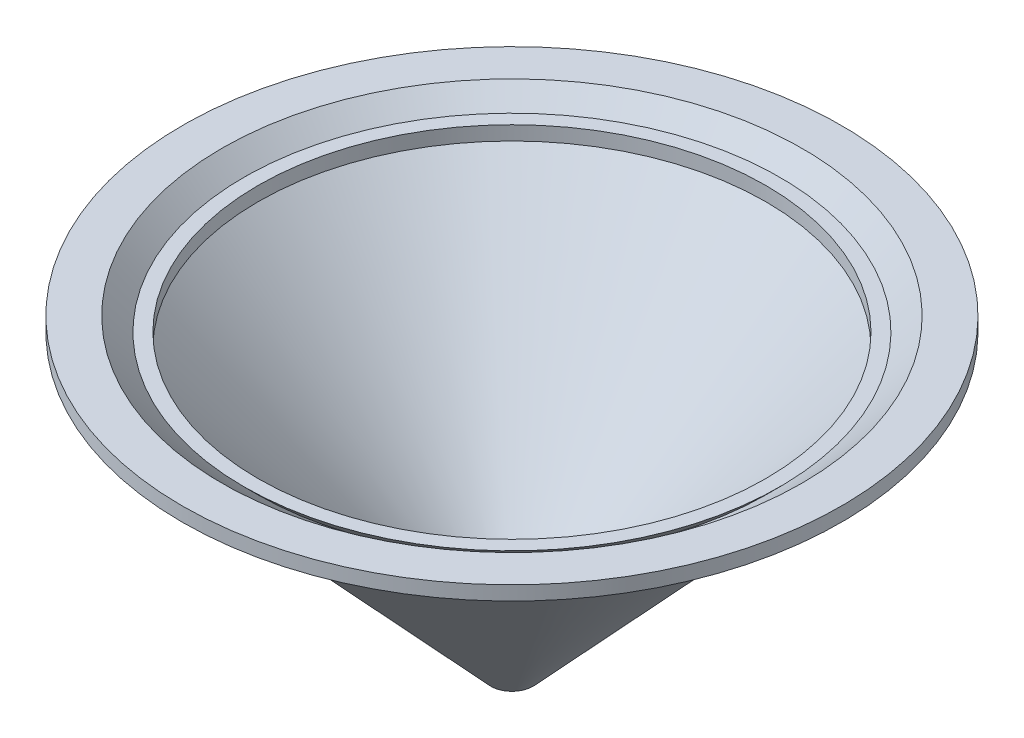
ISO-10303-21;
HEADER;
FILE_DESCRIPTION(('STEP AP214'),'2;1');
FILE_NAME('part.step','',(''),(''),'','','');
FILE_SCHEMA(('AUTOMOTIVE_DESIGN { 1 0 10303 214 1 1 1 1 }'));
ENDSEC;
DATA;
#1=APPLICATION_CONTEXT('core data for automotive mechanical design processes');
#2=APPLICATION_PROTOCOL_DEFINITION('international standard','automotive_design',2000,#1);
#3=PRODUCT_CONTEXT('',#1,'mechanical');
#4=PRODUCT('Part','Part','',(#3));
#5=PRODUCT_RELATED_PRODUCT_CATEGORY('part','',(#4));
#6=PRODUCT_DEFINITION_FORMATION('','',#4);
#7=PRODUCT_DEFINITION_CONTEXT('part definition',#1,'design');
#8=PRODUCT_DEFINITION('design','',#6,#7);
#9=PRODUCT_DEFINITION_SHAPE('','',#8);
#10=(LENGTH_UNIT() NAMED_UNIT(*) SI_UNIT(.MILLI.,.METRE.));
#11=(NAMED_UNIT(*) PLANE_ANGLE_UNIT() SI_UNIT($,.RADIAN.));
#12=(NAMED_UNIT(*) SI_UNIT($,.STERADIAN.) SOLID_ANGLE_UNIT());
#13=UNCERTAINTY_MEASURE_WITH_UNIT(LENGTH_MEASURE(1.E-05),#10,'distance_accuracy_value','');
#14=(GEOMETRIC_REPRESENTATION_CONTEXT(3) GLOBAL_UNCERTAINTY_ASSIGNED_CONTEXT((#13)) GLOBAL_UNIT_ASSIGNED_CONTEXT((#10,
#11,#12)) REPRESENTATION_CONTEXT('',''));
#15=CARTESIAN_POINT('',(0.,0.,0.));
#16=DIRECTION('',(0.,0.,1.));
#17=DIRECTION('',(1.,0.,0.));
#18=AXIS2_PLACEMENT_3D('',#15,#16,#17);
#19=CARTESIAN_POINT('',(0.,0.,0.));
#20=DIRECTION('',(0.,1.,0.));
#21=DIRECTION('',(0.,0.,1.));
#22=AXIS2_PLACEMENT_3D('',#19,#20,#21);
#23=CYLINDRICAL_SURFACE('',#22,36.);
#24=CARTESIAN_POINT('',(0.,-2.,0.));
#25=DIRECTION('',(0.,1.,0.));
#26=DIRECTION('',(0.,0.,1.));
#27=AXIS2_PLACEMENT_3D('',#24,#25,#26);
#28=CIRCLE('',#27,36.);
#29=CARTESIAN_POINT('',(0.,-2.,36.));
#30=VERTEX_POINT('',#29);
#31=EDGE_CURVE('E53',#30,#30,#28,.T.);
#32=ORIENTED_EDGE('',*,*,#31,.F.);
#33=EDGE_LOOP('',(#32));
#34=FACE_BOUND('',#33,.T.);
#35=CARTESIAN_POINT('',(0.,0.,0.));
#36=DIRECTION('',(0.,1.,0.));
#37=DIRECTION('',(0.,0.,1.));
#38=AXIS2_PLACEMENT_3D('',#35,#36,#37);
#39=CIRCLE('',#38,36.);
#40=CARTESIAN_POINT('',(0.,0.,36.));
#41=VERTEX_POINT('',#40);
#42=EDGE_CURVE('E11',#41,#41,#39,.T.);
#43=ORIENTED_EDGE('',*,*,#42,.T.);
#44=EDGE_LOOP('',(#43));
#45=FACE_BOUND('',#44,.T.);
#46=ADVANCED_FACE('F43',(#34,#45),#23,.F.);
#47=CARTESIAN_POINT('',(0.,0.,38.));
#48=DIRECTION('',(0.,-1.,0.));
#49=DIRECTION('',(0.,0.,-1.));
#50=AXIS2_PLACEMENT_3D('',#47,#48,#49);
#51=PLANE('',#50);
#52=ORIENTED_EDGE('',*,*,#42,.F.);
#53=EDGE_LOOP('',(#52));
#54=FACE_BOUND('',#53,.T.);
#55=CARTESIAN_POINT('',(0.,0.,0.));
#56=DIRECTION('',(0.,1.,0.));
#57=DIRECTION('',(0.,0.,1.));
#58=AXIS2_PLACEMENT_3D('',#55,#56,#57);
#59=CIRCLE('',#58,38.);
#60=CARTESIAN_POINT('',(0.,0.,38.));
#61=VERTEX_POINT('',#60);
#62=EDGE_CURVE('E49',#61,#61,#59,.T.);
#63=ORIENTED_EDGE('',*,*,#62,.T.);
#64=EDGE_LOOP('',(#63));
#65=FACE_BOUND('',#64,.T.);
#66=ADVANCED_FACE('F63',(#54,#65),#51,.F.);
#67=CARTESIAN_POINT('',(0.,-2.,0.));
#68=DIRECTION('',(0.,1.,0.));
#69=DIRECTION('',(0.,0.,1.));
#70=AXIS2_PLACEMENT_3D('',#67,#68,#69);
#71=CONICAL_SURFACE('',#70,36.,0.785398163397449);
#72=ORIENTED_EDGE('',*,*,#62,.F.);
#73=EDGE_LOOP('',(#72));
#74=FACE_BOUND('',#73,.T.);
#75=ORIENTED_EDGE('',*,*,#31,.T.);
#76=EDGE_LOOP('',(#75));
#77=FACE_BOUND('',#76,.T.);
#78=ADVANCED_FACE('F60',(#74,#77),#71,.T.);
#79=CLOSED_SHELL('',(#46,#66,#78));
#80=MANIFOLD_SOLID_BREP('B2',#79);
#81=CARTESIAN_POINT('',(0.,-42.,0.));
#82=DIRECTION('',(0.,1.,0.));
#83=DIRECTION('',(-1.,0.,0.));
#84=AXIS2_PLACEMENT_3D('',#81,#82,#83);
#85=PLANE('',#84);
#86=CARTESIAN_POINT('',(0.,-42.,0.));
#87=DIRECTION('',(0.,1.,0.));
#88=DIRECTION('',(-1.,0.,0.));
#89=AXIS2_PLACEMENT_3D('',#86,#87,#88);
#90=CIRCLE('',#89,0.270718117922463);
#91=CARTESIAN_POINT('',(-0.270718117922459,-42.,0.));
#92=VERTEX_POINT('',#91);
#93=EDGE_CURVE('E114',#92,#92,#90,.T.);
#94=ORIENTED_EDGE('',*,*,#93,.T.);
#95=EDGE_LOOP('',(#94));
#96=FACE_BOUND('',#95,.T.);
#97=CARTESIAN_POINT('',(0.,-42.,0.));
#98=DIRECTION('',(0.,1.,0.));
#99=DIRECTION('',(-1.,0.,0.));
#100=AXIS2_PLACEMENT_3D('',#97,#98,#99);
#101=CIRCLE('',#100,3.);
#102=CARTESIAN_POINT('',(-2.99999999999999,-42.,0.));
#103=VERTEX_POINT('',#102);
#104=EDGE_CURVE('E42',#103,#103,#101,.T.);
#105=ORIENTED_EDGE('',*,*,#104,.F.);
#106=EDGE_LOOP('',(#105));
#107=FACE_BOUND('',#106,.T.);
#108=ADVANCED_FACE('F96',(#96,#107),#85,.F.);
#109=CARTESIAN_POINT('',(0.,0.,0.));
#110=DIRECTION('',(0.,1.,0.));
#111=DIRECTION('',(-1.,0.,0.));
#112=AXIS2_PLACEMENT_3D('',#109,#110,#111);
#113=CONICAL_SURFACE('',#112,42.,0.748378047523518);
#114=CARTESIAN_POINT('',(0.,0.,0.));
#115=DIRECTION('',(0.,1.,0.));
#116=DIRECTION('',(-1.,0.,0.));
#117=AXIS2_PLACEMENT_3D('',#114,#115,#116);
#118=CIRCLE('',#117,42.);
#119=CARTESIAN_POINT('',(-42.,0.,0.));
#120=VERTEX_POINT('',#119);
#121=EDGE_CURVE('E102',#120,#120,#118,.T.);
#122=CARTESIAN_POINT('',(-2.99999999999999,-42.,0.));
#123=CARTESIAN_POINT('',(-3.40624999999999,-41.5625,0.));
#124=CARTESIAN_POINT('',(-3.81249999999999,-41.125,0.));
#125=CARTESIAN_POINT('',(-4.62499999999999,-40.25,0.));
#126=CARTESIAN_POINT('',(-5.03125,-39.8125,0.));
#127=CARTESIAN_POINT('',(-5.84375,-38.9375,0.));
#128=CARTESIAN_POINT('',(-6.25,-38.5,0.));
#129=CARTESIAN_POINT('',(-7.0625,-37.625,0.));
#130=CARTESIAN_POINT('',(-7.46875,-37.1875,0.));
#131=CARTESIAN_POINT('',(-8.28125,-36.3125,0.));
#132=CARTESIAN_POINT('',(-8.68749999999999,-35.875,0.));
#133=CARTESIAN_POINT('',(-9.49999999999999,-35.,0.));
#134=CARTESIAN_POINT('',(-9.90624999999999,-34.5625,0.));
#135=CARTESIAN_POINT('',(-10.71875,-33.6875,0.));
#136=CARTESIAN_POINT('',(-11.125,-33.25,0.));
#137=CARTESIAN_POINT('',(-11.9375,-32.375,0.));
#138=CARTESIAN_POINT('',(-12.34375,-31.9375,0.));
#139=CARTESIAN_POINT('',(-13.15625,-31.0625,0.));
#140=CARTESIAN_POINT('',(-13.5625,-30.625,0.));
#141=CARTESIAN_POINT('',(-14.375,-29.75,0.));
#142=CARTESIAN_POINT('',(-14.78125,-29.3125,0.));
#143=CARTESIAN_POINT('',(-15.59375,-28.4375,0.));
#144=CARTESIAN_POINT('',(-16.,-28.,0.));
#145=CARTESIAN_POINT('',(-16.8125,-27.125,0.));
#146=CARTESIAN_POINT('',(-17.21875,-26.6875,0.));
#147=CARTESIAN_POINT('',(-18.03125,-25.8125,0.));
#148=CARTESIAN_POINT('',(-18.4375,-25.375,0.));
#149=CARTESIAN_POINT('',(-19.25,-24.5,0.));
#150=CARTESIAN_POINT('',(-19.65625,-24.0625,0.));
#151=CARTESIAN_POINT('',(-20.46875,-23.1875,0.));
#152=CARTESIAN_POINT('',(-20.875,-22.75,0.));
#153=CARTESIAN_POINT('',(-21.6875,-21.875,0.));
#154=CARTESIAN_POINT('',(-22.09375,-21.4375,0.));
#155=CARTESIAN_POINT('',(-22.90625,-20.5625,0.));
#156=CARTESIAN_POINT('',(-23.3125,-20.125,0.));
#157=CARTESIAN_POINT('',(-24.125,-19.25,0.));
#158=CARTESIAN_POINT('',(-24.53125,-18.8125,0.));
#159=CARTESIAN_POINT('',(-25.34375,-17.9375,0.));
#160=CARTESIAN_POINT('',(-25.75,-17.5,0.));
#161=CARTESIAN_POINT('',(-26.5625,-16.625,0.));
#162=CARTESIAN_POINT('',(-26.96875,-16.1875,0.));
#163=CARTESIAN_POINT('',(-27.78125,-15.3125,0.));
#164=CARTESIAN_POINT('',(-28.1875,-14.875,0.));
#165=CARTESIAN_POINT('',(-29.,-14.,0.));
#166=CARTESIAN_POINT('',(-29.40625,-13.5625,0.));
#167=CARTESIAN_POINT('',(-30.21875,-12.6875,0.));
#168=CARTESIAN_POINT('',(-30.625,-12.25,0.));
#169=CARTESIAN_POINT('',(-31.4375,-11.375,0.));
#170=CARTESIAN_POINT('',(-31.84375,-10.9375,0.));
#171=CARTESIAN_POINT('',(-32.65625,-10.0625,0.));
#172=CARTESIAN_POINT('',(-33.0625,-9.625,0.));
#173=CARTESIAN_POINT('',(-33.875,-8.75,0.));
#174=CARTESIAN_POINT('',(-34.28125,-8.3125,0.));
#175=CARTESIAN_POINT('',(-35.09375,-7.4375,0.));
#176=CARTESIAN_POINT('',(-35.5,-7.,0.));
#177=CARTESIAN_POINT('',(-36.3125,-6.125,0.));
#178=CARTESIAN_POINT('',(-36.71875,-5.6875,0.));
#179=CARTESIAN_POINT('',(-37.53125,-4.8125,0.));
#180=CARTESIAN_POINT('',(-37.9375,-4.375,0.));
#181=CARTESIAN_POINT('',(-38.75,-3.5,0.));
#182=CARTESIAN_POINT('',(-39.15625,-3.0625,0.));
#183=CARTESIAN_POINT('',(-39.96875,-2.1875,0.));
#184=CARTESIAN_POINT('',(-40.375,-1.75,0.));
#185=CARTESIAN_POINT('',(-41.1875,-0.875000000000002,0.));
#186=CARTESIAN_POINT('',(-41.59375,-0.437500000000002,0.));
#187=CARTESIAN_POINT('',(-42.,0.,0.));
#188=B_SPLINE_CURVE_WITH_KNOTS('',3,(#122,#123,#124,#125,#126,#127,#128,#129,#130,#131,#132,
#133,#134,#135,#136,#137,#138,#139,#140,#141,#142,#143,#144,#145,#146,#147,#148,#149,#150,#151,
#152,#153,#154,#155,#156,#157,#158,#159,#160,#161,#162,#163,#164,#165,#166,#167,#168,#169,#170,
#171,#172,#173,#174,#175,#176,#177,#178,#179,#180,#181,#182,#183,#184,#185,#186,#187),
.UNSPECIFIED.,.F.,.F.,(4,2,2,2,2,2,2,2,2,2,2,2,2,2,2,2,2,2,2,2,2,2,2,2,2,2,2,2,2,2,2,2,4),(0.,
1.79109123511339,3.58218247022678,5.37327370534017,7.16436494045356,8.95545617556694,
10.7465474106803,12.5376386457937,14.3287298809071,16.1198211160205,17.9109123511339,
19.7020035862473,21.4930948213606,23.284186056474,25.0752772915874,26.8663685267008,
28.6574597618142,30.4485509969276,32.239642232041,34.0307334671544,35.8218247022678,
37.6129159373811,39.4040071724945,41.1950984076079,42.9861896427213,44.7772808778347,
46.5683721129481,48.3594633480615,50.1505545831748,51.9416458182882,53.7327370534016,
55.523828288515,57.3149195236284),.UNSPECIFIED.);
#189=EDGE_CURVE('BSEAM134',#103,#120,#188,.T.);
#190=ORIENTED_EDGE('',*,*,#104,.T.);
#191=ORIENTED_EDGE('',*,*,#121,.F.);
#192=ORIENTED_EDGE('',*,*,#189,.T.);
#193=ORIENTED_EDGE('',*,*,#189,.F.);
#194=EDGE_LOOP('',(#190,#192,#191,#193));
#195=FACE_BOUND('',#194,.T.);
#196=ADVANCED_FACE('F134',(#195),#113,.T.);
#197=CARTESIAN_POINT('',(0.,2.,0.));
#198=DIRECTION('',(0.,-1.,0.));
#199=DIRECTION('',(0.,0.,-1.));
#200=AXIS2_PLACEMENT_3D('',#197,#198,#199);
#201=CYLINDRICAL_SURFACE('',#200,46.7275);
#202=CARTESIAN_POINT('',(0.,2.,0.));
#203=DIRECTION('',(0.,1.,0.));
#204=DIRECTION('',(0.,0.,1.));
#205=AXIS2_PLACEMENT_3D('',#202,#203,#204);
#206=CIRCLE('',#205,46.7275);
#207=CARTESIAN_POINT('',(0.,2.,46.7275));
#208=VERTEX_POINT('',#207);
#209=EDGE_CURVE('E106',#208,#208,#206,.T.);
#210=ORIENTED_EDGE('',*,*,#209,.F.);
#211=EDGE_LOOP('',(#210));
#212=FACE_BOUND('',#211,.T.);
#213=CARTESIAN_POINT('',(0.,0.,0.));
#214=DIRECTION('',(0.,1.,0.));
#215=DIRECTION('',(0.,0.,1.));
#216=AXIS2_PLACEMENT_3D('',#213,#214,#215);
#217=CIRCLE('',#216,46.7275);
#218=CARTESIAN_POINT('',(0.,0.,46.7275));
#219=VERTEX_POINT('',#218);
#220=EDGE_CURVE('E110',#219,#219,#217,.T.);
#221=ORIENTED_EDGE('',*,*,#220,.T.);
#222=EDGE_LOOP('',(#221));
#223=FACE_BOUND('',#222,.T.);
#224=ADVANCED_FACE('F128',(#212,#223),#201,.T.);
#225=CARTESIAN_POINT('',(0.,2.,0.));
#226=DIRECTION('',(0.,1.,0.));
#227=DIRECTION('',(0.,0.,1.));
#228=AXIS2_PLACEMENT_3D('',#225,#226,#227);
#229=PLANE('',#228);
#230=CARTESIAN_POINT('',(0.,2.,0.));
#231=DIRECTION('',(0.,1.,0.));
#232=DIRECTION('',(0.,0.,1.));
#233=AXIS2_PLACEMENT_3D('',#230,#231,#232);
#234=CIRCLE('',#233,41.1278609750653);
#235=CARTESIAN_POINT('',(-41.1278609750653,2.,0.));
#236=VERTEX_POINT('',#235);
#237=EDGE_CURVE('E118',#236,#236,#234,.T.);
#238=ORIENTED_EDGE('',*,*,#237,.F.);
#239=EDGE_LOOP('',(#238));
#240=FACE_BOUND('',#239,.T.);
#241=ORIENTED_EDGE('',*,*,#209,.T.);
#242=EDGE_LOOP('',(#241));
#243=FACE_BOUND('',#242,.T.);
#244=ADVANCED_FACE('F124',(#240,#243),#229,.T.);
#245=CARTESIAN_POINT('',(0.,0.,0.));
#246=DIRECTION('',(0.,1.,0.));
#247=DIRECTION('',(0.,0.,1.));
#248=AXIS2_PLACEMENT_3D('',#245,#246,#247);
#249=PLANE('',#248);
#250=ORIENTED_EDGE('',*,*,#121,.T.);
#251=EDGE_LOOP('',(#250));
#252=FACE_BOUND('',#251,.T.);
#253=ORIENTED_EDGE('',*,*,#220,.F.);
#254=EDGE_LOOP('',(#253));
#255=FACE_BOUND('',#254,.T.);
#256=ADVANCED_FACE('F127',(#252,#255),#249,.F.);
#257=CARTESIAN_POINT('',(0.,1.36090219873456,0.));
#258=DIRECTION('',(0.,1.,0.));
#259=DIRECTION('',(-1.,0.,0.));
#260=AXIS2_PLACEMENT_3D('',#257,#258,#259);
#261=CONICAL_SURFACE('',#260,40.5344130167474,0.748378047523518);
#262=CARTESIAN_POINT('',(-0.270718117922459,-42.,0.));
#263=CARTESIAN_POINT('',(-0.696313356017694,-41.5416666666667,0.));
#264=CARTESIAN_POINT('',(-1.12190859411293,-41.0833333333333,0.));
#265=CARTESIAN_POINT('',(-1.97309907030341,-40.1666666666667,0.));
#266=CARTESIAN_POINT('',(-2.39869430839865,-39.7083333333333,0.));
#267=CARTESIAN_POINT('',(-3.24988478458912,-38.7916666666667,0.));
#268=CARTESIAN_POINT('',(-3.67548002268436,-38.3333333333333,0.));
#269=CARTESIAN_POINT('',(-4.52667049887484,-37.4166666666667,0.));
#270=CARTESIAN_POINT('',(-4.95226573697007,-36.9583333333333,0.));
#271=CARTESIAN_POINT('',(-5.80345621316055,-36.0416666666667,0.));
#272=CARTESIAN_POINT('',(-6.22905145125579,-35.5833333333333,0.));
#273=CARTESIAN_POINT('',(-7.08024192744627,-34.6666666666667,0.));
#274=CARTESIAN_POINT('',(-7.50583716554151,-34.2083333333333,0.));
#275=CARTESIAN_POINT('',(-8.35702764173198,-33.2916666666667,0.));
#276=CARTESIAN_POINT('',(-8.78262287982722,-32.8333333333333,0.));
#277=CARTESIAN_POINT('',(-9.63381335601769,-31.9166666666667,0.));
#278=CARTESIAN_POINT('',(-10.0594085941129,-31.4583333333333,0.));
#279=CARTESIAN_POINT('',(-10.9105990703034,-30.5416666666667,0.));
#280=CARTESIAN_POINT('',(-11.3361943083986,-30.0833333333333,0.));
#281=CARTESIAN_POINT('',(-12.1873847845891,-29.1666666666667,0.));
#282=CARTESIAN_POINT('',(-12.6129800226844,-28.7083333333333,0.));
#283=CARTESIAN_POINT('',(-13.4641704988748,-27.7916666666667,0.));
#284=CARTESIAN_POINT('',(-13.8897657369701,-27.3333333333333,0.));
#285=CARTESIAN_POINT('',(-14.7409562131606,-26.4166666666667,0.));
#286=CARTESIAN_POINT('',(-15.1665514512558,-25.9583333333333,0.));
#287=CARTESIAN_POINT('',(-16.0177419274463,-25.0416666666667,0.));
#288=CARTESIAN_POINT('',(-16.4433371655415,-24.5833333333333,0.));
#289=CARTESIAN_POINT('',(-17.294527641732,-23.6666666666667,0.));
#290=CARTESIAN_POINT('',(-17.7201228798272,-23.2083333333333,0.));
#291=CARTESIAN_POINT('',(-18.5713133560177,-22.2916666666667,0.));
#292=CARTESIAN_POINT('',(-18.9969085941129,-21.8333333333333,0.));
#293=CARTESIAN_POINT('',(-19.8480990703034,-20.9166666666667,0.));
#294=CARTESIAN_POINT('',(-20.2736943083986,-20.4583333333333,0.));
#295=CARTESIAN_POINT('',(-21.1248847845891,-19.5416666666667,0.));
#296=CARTESIAN_POINT('',(-21.5504800226844,-19.0833333333333,0.));
#297=CARTESIAN_POINT('',(-22.4016704988748,-18.1666666666667,0.));
#298=CARTESIAN_POINT('',(-22.8272657369701,-17.7083333333333,0.));
#299=CARTESIAN_POINT('',(-23.6784562131606,-16.7916666666667,0.));
#300=CARTESIAN_POINT('',(-24.1040514512558,-16.3333333333333,0.));
#301=CARTESIAN_POINT('',(-24.9552419274463,-15.4166666666667,0.));
#302=CARTESIAN_POINT('',(-25.3808371655415,-14.9583333333333,0.));
#303=CARTESIAN_POINT('',(-26.232027641732,-14.0416666666667,0.));
#304=CARTESIAN_POINT('',(-26.6576228798272,-13.5833333333333,0.));
#305=CARTESIAN_POINT('',(-27.5088133560177,-12.6666666666667,0.));
#306=CARTESIAN_POINT('',(-27.9344085941129,-12.2083333333333,0.));
#307=CARTESIAN_POINT('',(-28.7855990703034,-11.2916666666667,0.));
#308=CARTESIAN_POINT('',(-29.2111943083986,-10.8333333333333,0.));
#309=CARTESIAN_POINT('',(-30.0623847845891,-9.91666666666667,0.));
#310=CARTESIAN_POINT('',(-30.4879800226844,-9.45833333333334,0.));
#311=CARTESIAN_POINT('',(-31.3391704988748,-8.54166666666667,0.));
#312=CARTESIAN_POINT('',(-31.7647657369701,-8.08333333333334,0.));
#313=CARTESIAN_POINT('',(-32.6159562131606,-7.16666666666667,0.));
#314=CARTESIAN_POINT('',(-33.0415514512558,-6.70833333333334,0.));
#315=CARTESIAN_POINT('',(-33.8927419274463,-5.79166666666667,0.));
#316=CARTESIAN_POINT('',(-34.3183371655415,-5.33333333333333,0.));
#317=CARTESIAN_POINT('',(-35.169527641732,-4.41666666666667,0.));
#318=CARTESIAN_POINT('',(-35.5951228798272,-3.95833333333333,0.));
#319=CARTESIAN_POINT('',(-36.4463133560177,-3.04166666666667,0.));
#320=CARTESIAN_POINT('',(-36.8719085941129,-2.58333333333334,0.));
#321=CARTESIAN_POINT('',(-37.7230990703034,-1.66666666666667,0.));
#322=CARTESIAN_POINT('',(-38.1486943083987,-1.20833333333334,0.));
#323=CARTESIAN_POINT('',(-38.9998847845891,-0.291666666666672,0.));
#324=CARTESIAN_POINT('',(-39.4254800226844,0.166666666666662,0.));
#325=CARTESIAN_POINT('',(-40.2766704988748,1.08333333333333,0.));
#326=CARTESIAN_POINT('',(-40.7022657369701,1.54166666666666,0.));
#327=CARTESIAN_POINT('',(-41.1278609750653,2.,0.));
#328=B_SPLINE_CURVE_WITH_KNOTS('',3,(#262,#263,#264,#265,#266,#267,#268,#269,#270,#271,#272,
#273,#274,#275,#276,#277,#278,#279,#280,#281,#282,#283,#284,#285,#286,#287,#288,#289,#290,#291,
#292,#293,#294,#295,#296,#297,#298,#299,#300,#301,#302,#303,#304,#305,#306,#307,#308,#309,#310,
#311,#312,#313,#314,#315,#316,#317,#318,#319,#320,#321,#322,#323,#324,#325,#326,#327),
.UNSPECIFIED.,.F.,.F.,(4,2,2,2,2,2,2,2,2,2,2,2,2,2,2,2,2,2,2,2,2,2,2,2,2,2,2,2,2,2,2,2,4),(0.,
1.87638129392831,3.75276258785662,5.62914388178493,7.50552517571324,9.38190646964155,
11.2582877635699,13.1346690574982,15.0110503514265,16.8874316453548,18.7638129392831,
20.6401942332114,22.5165755271397,24.392956821068,26.2693381149964,28.1457194089247,
30.022100702853,31.8984819967813,33.7748632907096,35.6512445846379,37.5276258785662,
39.4040071724945,41.2803884664228,43.1567697603511,45.0331510542794,46.9095323482078,
48.7859136421361,50.6622949360644,52.5386762299927,54.415057523921,56.2914388178493,
58.1678201117776,60.0442014057059),.UNSPECIFIED.);
#329=EDGE_CURVE('BSEAM122',#92,#236,#328,.T.);
#330=ORIENTED_EDGE('',*,*,#93,.F.);
#331=ORIENTED_EDGE('',*,*,#237,.T.);
#332=ORIENTED_EDGE('',*,*,#329,.T.);
#333=ORIENTED_EDGE('',*,*,#329,.F.);
#334=EDGE_LOOP('',(#330,#332,#331,#333));
#335=FACE_BOUND('',#334,.T.);
#336=ADVANCED_FACE('F122',(#335),#261,.F.);
#337=CLOSED_SHELL('',(#108,#196,#224,#244,#256,#336));
#338=MANIFOLD_SOLID_BREP('B6',#337);
#339=ADVANCED_BREP_SHAPE_REPRESENTATION('',(#18,#80,#338),#14);
#340=SHAPE_DEFINITION_REPRESENTATION(#9,#339);
ENDSEC;
END-ISO-10303-21;
